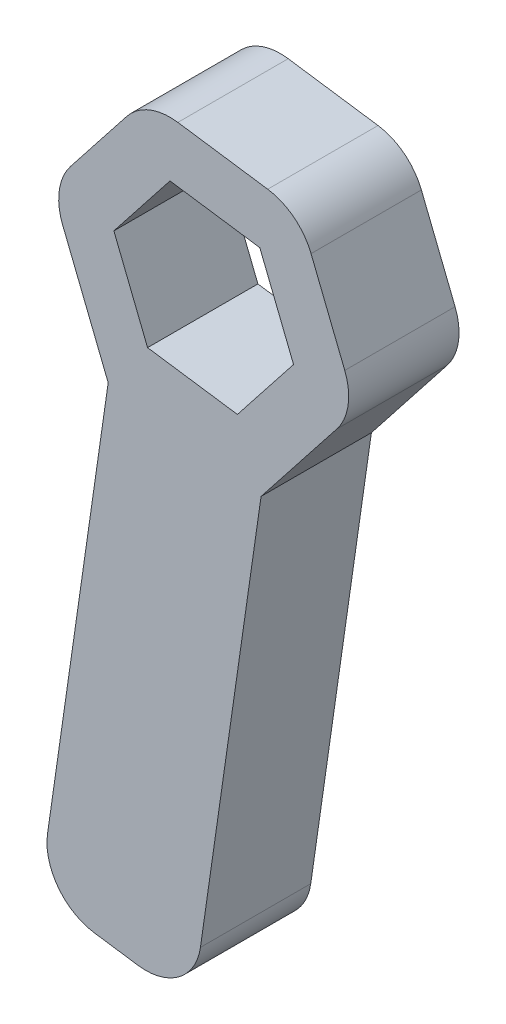
ISO-10303-21;
HEADER;
FILE_DESCRIPTION(('STEP AP214'),'2;1');
FILE_NAME('part.step','',(''),(''),'','','');
FILE_SCHEMA(('AUTOMOTIVE_DESIGN { 1 0 10303 214 1 1 1 1 }'));
ENDSEC;
DATA;
#1=APPLICATION_CONTEXT('core data for automotive mechanical design processes');
#2=APPLICATION_PROTOCOL_DEFINITION('international standard','automotive_design',2000,#1);
#3=PRODUCT_CONTEXT('',#1,'mechanical');
#4=PRODUCT('Part','Part','',(#3));
#5=PRODUCT_RELATED_PRODUCT_CATEGORY('part','',(#4));
#6=PRODUCT_DEFINITION_FORMATION('','',#4);
#7=PRODUCT_DEFINITION_CONTEXT('part definition',#1,'design');
#8=PRODUCT_DEFINITION('design','',#6,#7);
#9=PRODUCT_DEFINITION_SHAPE('','',#8);
#10=(LENGTH_UNIT() NAMED_UNIT(*) SI_UNIT(.MILLI.,.METRE.));
#11=(NAMED_UNIT(*) PLANE_ANGLE_UNIT() SI_UNIT($,.RADIAN.));
#12=(NAMED_UNIT(*) SI_UNIT($,.STERADIAN.) SOLID_ANGLE_UNIT());
#13=UNCERTAINTY_MEASURE_WITH_UNIT(LENGTH_MEASURE(1.E-05),#10,'distance_accuracy_value','');
#14=(GEOMETRIC_REPRESENTATION_CONTEXT(3) GLOBAL_UNCERTAINTY_ASSIGNED_CONTEXT((#13)) GLOBAL_UNIT_ASSIGNED_CONTEXT((#10,
#11,#12)) REPRESENTATION_CONTEXT('',''));
#15=CARTESIAN_POINT('',(0.,0.,0.));
#16=DIRECTION('',(0.,0.,1.));
#17=DIRECTION('',(1.,0.,0.));
#18=AXIS2_PLACEMENT_3D('',#15,#16,#17);
#19=CARTESIAN_POINT('',(-0.406423067225149,-2.82087225702039,4.));
#20=DIRECTION('',(0.14260458499128,0.9897797393054,0.));
#21=DIRECTION('',(-0.9897797393054,0.14260458499128,0.));
#22=AXIS2_PLACEMENT_3D('',#19,#20,#21);
#23=PLANE('',#22);
#24=DIRECTION('',(0.9897797393054,-0.14260458499128,0.));
#25=VECTOR('',#24,1.);
#26=CARTESIAN_POINT('',(-0.406423067225149,-2.82087225702039,0.));
#27=LINE('',#26,#25);
#28=CARTESIAN_POINT('',(-2.03505442416542,-2.58622378975308,0.));
#29=VERTEX_POINT('',#28);
#30=CARTESIAN_POINT('',(1.22220828971512,-3.0555207242877,0.));
#31=VERTEX_POINT('',#30);
#32=EDGE_CURVE('E247',#29,#31,#27,.T.);
#33=ORIENTED_EDGE('',*,*,#32,.F.);
#34=DIRECTION('',(0.,0.,-1.));
#35=VECTOR('',#34,1.);
#36=CARTESIAN_POINT('',(-2.03505442416542,-2.58622378975308,4.));
#37=LINE('',#36,#35);
#38=CARTESIAN_POINT('',(-2.03505442416542,-2.58622378975308,4.));
#39=VERTEX_POINT('',#38);
#40=EDGE_CURVE('E11',#39,#29,#37,.T.);
#41=ORIENTED_EDGE('',*,*,#40,.F.);
#42=DIRECTION('',(0.9897797393054,-0.14260458499128,0.));
#43=VECTOR('',#42,1.);
#44=CARTESIAN_POINT('',(-0.406423067225149,-2.82087225702039,4.));
#45=LINE('',#44,#43);
#46=CARTESIAN_POINT('',(1.22220828971512,-3.0555207242877,4.));
#47=VERTEX_POINT('',#46);
#48=EDGE_CURVE('E561',#39,#47,#45,.T.);
#49=ORIENTED_EDGE('',*,*,#48,.T.);
#50=DIRECTION('',(0.,0.,-1.));
#51=VECTOR('',#50,1.);
#52=CARTESIAN_POINT('',(1.22220828971512,-3.0555207242877,4.));
#53=LINE('',#52,#51);
#54=EDGE_CURVE('E58',#47,#31,#53,.T.);
#55=ORIENTED_EDGE('',*,*,#54,.T.);
#56=EDGE_LOOP('',(#33,#41,#49,#55));
#57=FACE_BOUND('',#56,.T.);
#58=ADVANCED_FACE('F39',(#57),#23,.T.);
#59=CARTESIAN_POINT('',(-2.64615856902298,-1.05846342760923,4.));
#60=DIRECTION('',(0.928476690885255,0.371390676354114,0.));
#61=DIRECTION('',(-0.371390676354114,0.928476690885255,0.));
#62=AXIS2_PLACEMENT_3D('',#59,#60,#61);
#63=PLANE('',#62);
#64=DIRECTION('',(0.371390676354114,-0.928476690885255,0.));
#65=VECTOR('',#64,1.);
#66=CARTESIAN_POINT('',(-2.64615856902298,-1.05846342760923,0.));
#67=LINE('',#66,#65);
#68=CARTESIAN_POINT('',(-3.25726271388054,0.469296934534627,0.));
#69=VERTEX_POINT('',#68);
#70=EDGE_CURVE('E249',#69,#29,#67,.T.);
#71=ORIENTED_EDGE('',*,*,#70,.F.);
#72=DIRECTION('',(0.,0.,-1.));
#73=VECTOR('',#72,1.);
#74=CARTESIAN_POINT('',(-3.25726271388054,0.469296934534627,4.));
#75=LINE('',#74,#73);
#76=CARTESIAN_POINT('',(-3.25726271388054,0.469296934534627,4.));
#77=VERTEX_POINT('',#76);
#78=EDGE_CURVE('E49',#77,#69,#75,.T.);
#79=ORIENTED_EDGE('',*,*,#78,.F.);
#80=DIRECTION('',(0.371390676354114,-0.928476690885255,0.));
#81=VECTOR('',#80,1.);
#82=CARTESIAN_POINT('',(-2.64615856902298,-1.05846342760923,4.));
#83=LINE('',#82,#81);
#84=EDGE_CURVE('E563',#77,#39,#83,.T.);
#85=ORIENTED_EDGE('',*,*,#84,.T.);
#86=ORIENTED_EDGE('',*,*,#40,.T.);
#87=EDGE_LOOP('',(#71,#79,#85,#86));
#88=FACE_BOUND('',#87,.T.);
#89=ADVANCED_FACE('F381',(#88),#63,.T.);
#90=CARTESIAN_POINT('',(-2.23973550179783,1.76240882941116,4.));
#91=DIRECTION('',(0.785872105893975,-0.618389062951286,0.));
#92=DIRECTION('',(0.618389062951286,0.785872105893975,0.));
#93=AXIS2_PLACEMENT_3D('',#90,#91,#92);
#94=PLANE('',#93);
#95=DIRECTION('',(-0.618389062951286,-0.785872105893975,0.));
#96=VECTOR('',#95,1.);
#97=CARTESIAN_POINT('',(-2.23973550179783,1.76240882941116,0.));
#98=LINE('',#97,#96);
#99=CARTESIAN_POINT('',(-1.22220828971512,3.0555207242877,0.));
#100=VERTEX_POINT('',#99);
#101=EDGE_CURVE('E252',#100,#69,#98,.T.);
#102=ORIENTED_EDGE('',*,*,#101,.F.);
#103=DIRECTION('',(0.,0.,-1.));
#104=VECTOR('',#103,1.);
#105=CARTESIAN_POINT('',(-1.22220828971512,3.0555207242877,4.));
#106=LINE('',#105,#104);
#107=CARTESIAN_POINT('',(-1.22220828971512,3.0555207242877,4.));
#108=VERTEX_POINT('',#107);
#109=EDGE_CURVE('E192',#108,#100,#106,.T.);
#110=ORIENTED_EDGE('',*,*,#109,.F.);
#111=DIRECTION('',(-0.618389062951286,-0.785872105893975,0.));
#112=VECTOR('',#111,1.);
#113=CARTESIAN_POINT('',(-2.23973550179783,1.76240882941116,4.));
#114=LINE('',#113,#112);
#115=EDGE_CURVE('E203',#108,#77,#114,.T.);
#116=ORIENTED_EDGE('',*,*,#115,.T.);
#117=ORIENTED_EDGE('',*,*,#78,.T.);
#118=EDGE_LOOP('',(#102,#110,#116,#117));
#119=FACE_BOUND('',#118,.T.);
#120=ADVANCED_FACE('F386',(#119),#94,.T.);
#121=CARTESIAN_POINT('',(0.406423067225149,2.82087225702039,4.));
#122=DIRECTION('',(-0.14260458499128,-0.9897797393054,0.));
#123=DIRECTION('',(0.9897797393054,-0.14260458499128,0.));
#124=AXIS2_PLACEMENT_3D('',#121,#122,#123);
#125=PLANE('',#124);
#126=DIRECTION('',(-0.9897797393054,0.14260458499128,0.));
#127=VECTOR('',#126,1.);
#128=CARTESIAN_POINT('',(0.406423067225149,2.82087225702039,0.));
#129=LINE('',#128,#127);
#130=CARTESIAN_POINT('',(2.03505442416542,2.58622378975308,0.));
#131=VERTEX_POINT('',#130);
#132=EDGE_CURVE('E188',#131,#100,#129,.T.);
#133=ORIENTED_EDGE('',*,*,#132,.F.);
#134=DIRECTION('',(0.,0.,-1.));
#135=VECTOR('',#134,1.);
#136=CARTESIAN_POINT('',(2.03505442416542,2.58622378975308,4.));
#137=LINE('',#136,#135);
#138=CARTESIAN_POINT('',(2.03505442416542,2.58622378975308,4.));
#139=VERTEX_POINT('',#138);
#140=EDGE_CURVE('E183',#139,#131,#137,.T.);
#141=ORIENTED_EDGE('',*,*,#140,.F.);
#142=DIRECTION('',(-0.9897797393054,0.14260458499128,0.));
#143=VECTOR('',#142,1.);
#144=CARTESIAN_POINT('',(0.406423067225149,2.82087225702039,4.));
#145=LINE('',#144,#143);
#146=EDGE_CURVE('E186',#139,#108,#145,.T.);
#147=ORIENTED_EDGE('',*,*,#146,.T.);
#148=ORIENTED_EDGE('',*,*,#109,.T.);
#149=EDGE_LOOP('',(#133,#141,#147,#148));
#150=FACE_BOUND('',#149,.T.);
#151=ADVANCED_FACE('F185',(#150),#125,.T.);
#152=CARTESIAN_POINT('',(2.64615856902298,1.05846342760923,4.));
#153=DIRECTION('',(-0.928476690885255,-0.371390676354114,0.));
#154=DIRECTION('',(0.371390676354114,-0.928476690885255,0.));
#155=AXIS2_PLACEMENT_3D('',#152,#153,#154);
#156=PLANE('',#155);
#157=DIRECTION('',(-0.371390676354114,0.928476690885255,0.));
#158=VECTOR('',#157,1.);
#159=CARTESIAN_POINT('',(2.64615856902298,1.05846342760923,0.));
#160=LINE('',#159,#158);
#161=CARTESIAN_POINT('',(3.25726271388054,-0.469296934534628,0.));
#162=VERTEX_POINT('',#161);
#163=EDGE_CURVE('E256',#162,#131,#160,.T.);
#164=ORIENTED_EDGE('',*,*,#163,.F.);
#165=DIRECTION('',(0.,0.,-1.));
#166=VECTOR('',#165,1.);
#167=CARTESIAN_POINT('',(3.25726271388054,-0.469296934534628,4.));
#168=LINE('',#167,#166);
#169=CARTESIAN_POINT('',(3.25726271388054,-0.469296934534628,4.));
#170=VERTEX_POINT('',#169);
#171=EDGE_CURVE('E119',#170,#162,#168,.T.);
#172=ORIENTED_EDGE('',*,*,#171,.F.);
#173=DIRECTION('',(-0.371390676354114,0.928476690885255,0.));
#174=VECTOR('',#173,1.);
#175=CARTESIAN_POINT('',(2.64615856902298,1.05846342760923,4.));
#176=LINE('',#175,#174);
#177=EDGE_CURVE('E200',#170,#139,#176,.T.);
#178=ORIENTED_EDGE('',*,*,#177,.T.);
#179=ORIENTED_EDGE('',*,*,#140,.T.);
#180=EDGE_LOOP('',(#164,#172,#178,#179));
#181=FACE_BOUND('',#180,.T.);
#182=ADVANCED_FACE('F205',(#181),#156,.T.);
#183=CARTESIAN_POINT('',(-3.25726271388054,0.469296934534626,4.));
#184=DIRECTION('',(0.,0.,-1.));
#185=DIRECTION('',(-1.,0.,0.));
#186=AXIS2_PLACEMENT_3D('',#183,#184,#185);
#187=CYLINDRICAL_SURFACE('',#186,2.);
#188=CARTESIAN_POINT('',(-3.25726271388054,0.469296934534626,0.));
#189=DIRECTION('',(0.,0.,1.));
#190=DIRECTION('',(1.,0.,0.));
#191=AXIS2_PLACEMENT_3D('',#188,#189,#190);
#192=CIRCLE('',#191,2.);
#193=CARTESIAN_POINT('',(-5.11421609565105,-0.273484418173602,0.));
#194=VERTEX_POINT('',#193);
#195=CARTESIAN_POINT('',(-4.82900692566849,1.7060750604372,0.));
#196=VERTEX_POINT('',#195);
#197=EDGE_CURVE('E212',#194,#196,#192,.F.);
#198=ORIENTED_EDGE('',*,*,#197,.F.);
#199=DIRECTION('',(0.,0.,-1.));
#200=VECTOR('',#199,1.);
#201=CARTESIAN_POINT('',(-5.11421609565105,-0.273484418173602,4.));
#202=LINE('',#201,#200);
#203=CARTESIAN_POINT('',(-5.11421609565105,-0.273484418173602,4.));
#204=VERTEX_POINT('',#203);
#205=EDGE_CURVE('E43',#204,#194,#202,.T.);
#206=ORIENTED_EDGE('',*,*,#205,.F.);
#207=CARTESIAN_POINT('',(-3.25726271388054,0.469296934534626,4.));
#208=DIRECTION('',(0.,0.,1.));
#209=DIRECTION('',(1.,0.,0.));
#210=AXIS2_PLACEMENT_3D('',#207,#208,#209);
#211=CIRCLE('',#210,2.);
#212=CARTESIAN_POINT('',(-4.82900692566849,1.7060750604372,4.));
#213=VERTEX_POINT('',#212);
#214=EDGE_CURVE('E261',#204,#213,#211,.F.);
#215=ORIENTED_EDGE('',*,*,#214,.T.);
#216=DIRECTION('',(0.,0.,-1.));
#217=VECTOR('',#216,1.);
#218=CARTESIAN_POINT('',(-4.82900692566849,1.7060750604372,4.));
#219=LINE('',#218,#217);
#220=EDGE_CURVE('E208',#213,#196,#219,.T.);
#221=ORIENTED_EDGE('',*,*,#220,.T.);
#222=EDGE_LOOP('',(#198,#206,#215,#221));
#223=FACE_BOUND('',#222,.T.);
#224=ADVANCED_FACE('F41',(#223),#187,.T.);
#225=CARTESIAN_POINT('',(-4.50311195079349,-1.80124478031746,4.));
#226=DIRECTION('',(0.928476690885255,0.371390676354115,0.));
#227=DIRECTION('',(-0.371390676354115,0.928476690885255,0.));
#228=AXIS2_PLACEMENT_3D('',#225,#226,#227);
#229=PLANE('',#228);
#230=DIRECTION('',(0.371390676354115,-0.928476690885255,0.));
#231=VECTOR('',#230,1.);
#232=CARTESIAN_POINT('',(-4.50311195079349,-1.80124478031746,0.));
#233=LINE('',#232,#231);
#234=CARTESIAN_POINT('',(-3.4631627920008,-4.40111767729909,0.));
#235=VERTEX_POINT('',#234);
#236=EDGE_CURVE('E215',#194,#235,#233,.T.);
#237=ORIENTED_EDGE('',*,*,#236,.T.);
#238=DIRECTION('',(0.,0.,-1.));
#239=VECTOR('',#238,1.);
#240=CARTESIAN_POINT('',(-3.4631627920008,-4.40111767729909,4.));
#241=LINE('',#240,#239);
#242=CARTESIAN_POINT('',(-3.4631627920008,-4.40111767729909,4.));
#243=VERTEX_POINT('',#242);
#244=EDGE_CURVE('E294',#243,#235,#241,.T.);
#245=ORIENTED_EDGE('',*,*,#244,.F.);
#246=DIRECTION('',(0.371390676354115,-0.928476690885255,0.));
#247=VECTOR('',#246,1.);
#248=CARTESIAN_POINT('',(-4.50311195079349,-1.80124478031746,4.));
#249=LINE('',#248,#247);
#250=EDGE_CURVE('E303',#204,#243,#249,.T.);
#251=ORIENTED_EDGE('',*,*,#250,.F.);
#252=ORIENTED_EDGE('',*,*,#205,.T.);
#253=EDGE_LOOP('',(#237,#245,#251,#252));
#254=FACE_BOUND('',#253,.T.);
#255=ADVANCED_FACE('F302',(#254),#229,.F.);
#256=CARTESIAN_POINT('',(-2.77153055479309,0.399314058332094,4.));
#257=DIRECTION('',(0.9897797393054,-0.14260458499128,0.));
#258=DIRECTION('',(0.14260458499128,0.9897797393054,0.));
#259=AXIS2_PLACEMENT_3D('',#256,#257,#258);
#260=PLANE('',#259);
#261=DIRECTION('',(-0.14260458499128,-0.9897797393054,0.));
#262=VECTOR('',#261,1.);
#263=CARTESIAN_POINT('',(-2.77153055479309,0.399314058332094,0.));
#264=LINE('',#263,#262);
#265=CARTESIAN_POINT('',(-5.66170537007195,-19.6606053011237,0.));
#266=VERTEX_POINT('',#265);
#267=EDGE_CURVE('E217',#235,#266,#264,.T.);
#268=ORIENTED_EDGE('',*,*,#267,.T.);
#269=DIRECTION('',(0.,0.,-1.));
#270=VECTOR('',#269,1.);
#271=CARTESIAN_POINT('',(-5.66170537007195,-19.6606053011237,4.));
#272=LINE('',#271,#270);
#273=CARTESIAN_POINT('',(-5.66170537007195,-19.6606053011237,4.));
#274=VERTEX_POINT('',#273);
#275=EDGE_CURVE('E293',#274,#266,#272,.T.);
#276=ORIENTED_EDGE('',*,*,#275,.F.);
#277=DIRECTION('',(-0.14260458499128,-0.9897797393054,0.));
#278=VECTOR('',#277,1.);
#279=CARTESIAN_POINT('',(-2.77153055479309,0.399314058332094,4.));
#280=LINE('',#279,#278);
#281=EDGE_CURVE('E581',#243,#274,#280,.T.);
#282=ORIENTED_EDGE('',*,*,#281,.F.);
#283=ORIENTED_EDGE('',*,*,#244,.T.);
#284=EDGE_LOOP('',(#268,#276,#282,#283));
#285=FACE_BOUND('',#284,.T.);
#286=ADVANCED_FACE('F371',(#285),#260,.F.);
#287=CARTESIAN_POINT('',(-3.68214589146115,-19.9458144711063,4.));
#288=DIRECTION('',(0.,0.,-1.));
#289=DIRECTION('',(-1.,0.,0.));
#290=AXIS2_PLACEMENT_3D('',#287,#288,#289);
#291=CYLINDRICAL_SURFACE('',#290,2.);
#292=CARTESIAN_POINT('',(-3.68214589146115,-19.9458144711063,0.));
#293=DIRECTION('',(0.,0.,1.));
#294=DIRECTION('',(1.,0.,0.));
#295=AXIS2_PLACEMENT_3D('',#292,#293,#294);
#296=CIRCLE('',#295,2.);
#297=CARTESIAN_POINT('',(-3.96735506144371,-21.9253739497171,0.));
#298=VERTEX_POINT('',#297);
#299=EDGE_CURVE('E220',#298,#266,#296,.F.);
#300=ORIENTED_EDGE('',*,*,#299,.F.);
#301=DIRECTION('',(0.,0.,-1.));
#302=VECTOR('',#301,1.);
#303=CARTESIAN_POINT('',(-3.96735506144371,-21.9253739497171,4.));
#304=LINE('',#303,#302);
#305=CARTESIAN_POINT('',(-3.96735506144371,-21.9253739497171,4.));
#306=VERTEX_POINT('',#305);
#307=EDGE_CURVE('E291',#306,#298,#304,.T.);
#308=ORIENTED_EDGE('',*,*,#307,.F.);
#309=CARTESIAN_POINT('',(-3.68214589146115,-19.9458144711063,4.));
#310=DIRECTION('',(0.,0.,1.));
#311=DIRECTION('',(1.,0.,0.));
#312=AXIS2_PLACEMENT_3D('',#309,#310,#311);
#313=CIRCLE('',#312,2.);
#314=EDGE_CURVE('E370',#306,#274,#313,.F.);
#315=ORIENTED_EDGE('',*,*,#314,.T.);
#316=ORIENTED_EDGE('',*,*,#275,.T.);
#317=EDGE_LOOP('',(#300,#308,#315,#316));
#318=FACE_BOUND('',#317,.T.);
#319=ADVANCED_FACE('F365',(#318),#291,.T.);
#320=CARTESIAN_POINT('',(-3.17538398526146,-22.0394788380666,4.));
#321=DIRECTION('',(0.142604584991282,0.989779739305399,0.));
#322=DIRECTION('',(-0.989779739305399,0.142604584991282,0.));
#323=AXIS2_PLACEMENT_3D('',#320,#321,#322);
#324=PLANE('',#323);
#325=DIRECTION('',(0.989779739305399,-0.142604584991282,0.));
#326=VECTOR('',#325,1.);
#327=CARTESIAN_POINT('',(-3.17538398526146,-22.0394788380666,0.));
#328=LINE('',#327,#326);
#329=CARTESIAN_POINT('',(-2.38341290907914,-22.1535837264162,0.));
#330=VERTEX_POINT('',#329);
#331=EDGE_CURVE('E223',#298,#330,#328,.T.);
#332=ORIENTED_EDGE('',*,*,#331,.T.);
#333=DIRECTION('',(0.,0.,-1.));
#334=VECTOR('',#333,1.);
#335=CARTESIAN_POINT('',(-2.38341290907914,-22.1535837264162,4.));
#336=LINE('',#335,#334);
#337=CARTESIAN_POINT('',(-2.38341290907914,-22.1535837264162,4.));
#338=VERTEX_POINT('',#337);
#339=EDGE_CURVE('E289',#338,#330,#336,.T.);
#340=ORIENTED_EDGE('',*,*,#339,.F.);
#341=DIRECTION('',(0.989779739305399,-0.142604584991282,0.));
#342=VECTOR('',#341,1.);
#343=CARTESIAN_POINT('',(-3.17538398526146,-22.0394788380666,4.));
#344=LINE('',#343,#342);
#345=EDGE_CURVE('E578',#306,#338,#344,.T.);
#346=ORIENTED_EDGE('',*,*,#345,.F.);
#347=ORIENTED_EDGE('',*,*,#307,.T.);
#348=EDGE_LOOP('',(#332,#340,#346,#347));
#349=FACE_BOUND('',#348,.T.);
#350=ADVANCED_FACE('F378',(#349),#324,.F.);
#351=CARTESIAN_POINT('',(-2.09820373909657,-20.1740242478054,4.));
#352=DIRECTION('',(0.,0.,-1.));
#353=DIRECTION('',(-1.,0.,0.));
#354=AXIS2_PLACEMENT_3D('',#351,#352,#353);
#355=CYLINDRICAL_SURFACE('',#354,2.);
#356=CARTESIAN_POINT('',(-2.09820373909657,-20.1740242478054,0.));
#357=DIRECTION('',(0.,0.,1.));
#358=DIRECTION('',(1.,0.,0.));
#359=AXIS2_PLACEMENT_3D('',#356,#357,#358);
#360=CIRCLE('',#359,2.);
#361=CARTESIAN_POINT('',(-0.118644260485777,-20.4592334177879,0.));
#362=VERTEX_POINT('',#361);
#363=EDGE_CURVE('E226',#362,#330,#360,.F.);
#364=ORIENTED_EDGE('',*,*,#363,.F.);
#365=DIRECTION('',(0.,0.,-1.));
#366=VECTOR('',#365,1.);
#367=CARTESIAN_POINT('',(-0.118644260485777,-20.4592334177879,4.));
#368=LINE('',#367,#366);
#369=CARTESIAN_POINT('',(-0.118644260485777,-20.4592334177879,4.));
#370=VERTEX_POINT('',#369);
#371=EDGE_CURVE('E287',#370,#362,#368,.T.);
#372=ORIENTED_EDGE('',*,*,#371,.F.);
#373=CARTESIAN_POINT('',(-2.09820373909657,-20.1740242478054,4.));
#374=DIRECTION('',(0.,0.,1.));
#375=DIRECTION('',(1.,0.,0.));
#376=AXIS2_PLACEMENT_3D('',#373,#374,#375);
#377=CIRCLE('',#376,2.);
#378=EDGE_CURVE('E576',#370,#338,#377,.F.);
#379=ORIENTED_EDGE('',*,*,#378,.T.);
#380=ORIENTED_EDGE('',*,*,#339,.T.);
#381=EDGE_LOOP('',(#364,#372,#379,#380));
#382=FACE_BOUND('',#381,.T.);
#383=ADVANCED_FACE('F359',(#382),#355,.T.);
#384=CARTESIAN_POINT('',(2.77153055479309,-0.399314058332094,4.));
#385=DIRECTION('',(0.9897797393054,-0.14260458499128,0.));
#386=DIRECTION('',(0.14260458499128,0.9897797393054,0.));
#387=AXIS2_PLACEMENT_3D('',#384,#385,#386);
#388=PLANE('',#387);
#389=DIRECTION('',(-0.14260458499128,-0.9897797393054,0.));
#390=VECTOR('',#389,1.);
#391=CARTESIAN_POINT('',(2.77153055479309,-0.399314058332094,0.));
#392=LINE('',#391,#390);
#393=CARTESIAN_POINT('',(2.07989831758538,-5.19974579396328,0.));
#394=VERTEX_POINT('',#393);
#395=EDGE_CURVE('E229',#394,#362,#392,.T.);
#396=ORIENTED_EDGE('',*,*,#395,.F.);
#397=DIRECTION('',(0.,0.,-1.));
#398=VECTOR('',#397,1.);
#399=CARTESIAN_POINT('',(2.07989831758538,-5.19974579396328,4.));
#400=LINE('',#399,#398);
#401=CARTESIAN_POINT('',(2.07989831758538,-5.19974579396328,4.));
#402=VERTEX_POINT('',#401);
#403=EDGE_CURVE('E285',#402,#394,#400,.T.);
#404=ORIENTED_EDGE('',*,*,#403,.F.);
#405=DIRECTION('',(-0.14260458499128,-0.9897797393054,0.));
#406=VECTOR('',#405,1.);
#407=CARTESIAN_POINT('',(2.77153055479309,-0.399314058332094,4.));
#408=LINE('',#407,#406);
#409=EDGE_CURVE('E355',#402,#370,#408,.T.);
#410=ORIENTED_EDGE('',*,*,#409,.T.);
#411=ORIENTED_EDGE('',*,*,#371,.T.);
#412=EDGE_LOOP('',(#396,#404,#410,#411));
#413=FACE_BOUND('',#412,.T.);
#414=ADVANCED_FACE('F352',(#413),#388,.T.);
#415=CARTESIAN_POINT('',(3.81147971358578,-2.99918695531374,4.));
#416=DIRECTION('',(-0.785872105893975,0.618389062951286,0.));
#417=DIRECTION('',(-0.618389062951286,-0.785872105893975,0.));
#418=AXIS2_PLACEMENT_3D('',#415,#416,#417);
#419=PLANE('',#418);
#420=DIRECTION('',(0.618389062951286,0.785872105893975,0.));
#421=VECTOR('',#420,1.);
#422=CARTESIAN_POINT('',(3.81147971358578,-2.99918695531374,0.));
#423=LINE('',#422,#421);
#424=CARTESIAN_POINT('',(4.82900692566849,-1.7060750604372,0.));
#425=VERTEX_POINT('',#424);
#426=EDGE_CURVE('E232',#394,#425,#423,.T.);
#427=ORIENTED_EDGE('',*,*,#426,.T.);
#428=DIRECTION('',(0.,0.,-1.));
#429=VECTOR('',#428,1.);
#430=CARTESIAN_POINT('',(4.82900692566849,-1.7060750604372,4.));
#431=LINE('',#430,#429);
#432=CARTESIAN_POINT('',(4.82900692566849,-1.7060750604372,4.));
#433=VERTEX_POINT('',#432);
#434=EDGE_CURVE('E282',#433,#425,#431,.T.);
#435=ORIENTED_EDGE('',*,*,#434,.F.);
#436=DIRECTION('',(0.618389062951286,0.785872105893975,0.));
#437=VECTOR('',#436,1.);
#438=CARTESIAN_POINT('',(3.81147971358578,-2.99918695531374,4.));
#439=LINE('',#438,#437);
#440=EDGE_CURVE('E348',#402,#433,#439,.T.);
#441=ORIENTED_EDGE('',*,*,#440,.F.);
#442=ORIENTED_EDGE('',*,*,#403,.T.);
#443=EDGE_LOOP('',(#427,#435,#441,#442));
#444=FACE_BOUND('',#443,.T.);
#445=ADVANCED_FACE('F347',(#444),#419,.F.);
#446=CARTESIAN_POINT('',(3.25726271388054,-0.469296934534627,4.));
#447=DIRECTION('',(0.,0.,-1.));
#448=DIRECTION('',(-1.,0.,0.));
#449=AXIS2_PLACEMENT_3D('',#446,#447,#448);
#450=CYLINDRICAL_SURFACE('',#449,2.);
#451=CARTESIAN_POINT('',(3.25726271388054,-0.469296934534627,0.));
#452=DIRECTION('',(0.,0.,1.));
#453=DIRECTION('',(1.,0.,0.));
#454=AXIS2_PLACEMENT_3D('',#451,#452,#453);
#455=CIRCLE('',#454,2.);
#456=CARTESIAN_POINT('',(5.11421609565105,0.273484418173602,0.));
#457=VERTEX_POINT('',#456);
#458=EDGE_CURVE('E234',#425,#457,#455,.T.);
#459=ORIENTED_EDGE('',*,*,#458,.T.);
#460=DIRECTION('',(0.,0.,-1.));
#461=VECTOR('',#460,1.);
#462=CARTESIAN_POINT('',(5.11421609565105,0.273484418173602,4.));
#463=LINE('',#462,#461);
#464=CARTESIAN_POINT('',(5.11421609565105,0.273484418173602,4.));
#465=VERTEX_POINT('',#464);
#466=EDGE_CURVE('E279',#465,#457,#463,.T.);
#467=ORIENTED_EDGE('',*,*,#466,.F.);
#468=CARTESIAN_POINT('',(3.25726271388054,-0.469296934534627,4.));
#469=DIRECTION('',(0.,0.,1.));
#470=DIRECTION('',(1.,0.,0.));
#471=AXIS2_PLACEMENT_3D('',#468,#469,#470);
#472=CIRCLE('',#471,2.);
#473=EDGE_CURVE('E343',#433,#465,#472,.T.);
#474=ORIENTED_EDGE('',*,*,#473,.F.);
#475=ORIENTED_EDGE('',*,*,#434,.T.);
#476=EDGE_LOOP('',(#459,#467,#474,#475));
#477=FACE_BOUND('',#476,.T.);
#478=ADVANCED_FACE('F342',(#477),#450,.T.);
#479=CARTESIAN_POINT('',(4.50311195079349,1.80124478031745,4.));
#480=DIRECTION('',(-0.928476690885255,-0.371390676354114,0.));
#481=DIRECTION('',(0.371390676354114,-0.928476690885255,0.));
#482=AXIS2_PLACEMENT_3D('',#479,#480,#481);
#483=PLANE('',#482);
#484=DIRECTION('',(-0.371390676354114,0.928476690885255,0.));
#485=VECTOR('',#484,1.);
#486=CARTESIAN_POINT('',(4.50311195079349,1.80124478031745,0.));
#487=LINE('',#486,#485);
#488=CARTESIAN_POINT('',(3.89200780593593,3.3290051424613,0.));
#489=VERTEX_POINT('',#488);
#490=EDGE_CURVE('E236',#457,#489,#487,.T.);
#491=ORIENTED_EDGE('',*,*,#490,.T.);
#492=DIRECTION('',(0.,0.,-1.));
#493=VECTOR('',#492,1.);
#494=CARTESIAN_POINT('',(3.89200780593593,3.3290051424613,4.));
#495=LINE('',#494,#493);
#496=CARTESIAN_POINT('',(3.89200780593593,3.3290051424613,4.));
#497=VERTEX_POINT('',#496);
#498=EDGE_CURVE('E276',#497,#489,#495,.T.);
#499=ORIENTED_EDGE('',*,*,#498,.F.);
#500=DIRECTION('',(-0.371390676354114,0.928476690885255,0.));
#501=VECTOR('',#500,1.);
#502=CARTESIAN_POINT('',(4.50311195079349,1.80124478031745,4.));
#503=LINE('',#502,#501);
#504=EDGE_CURVE('E339',#465,#497,#503,.T.);
#505=ORIENTED_EDGE('',*,*,#504,.F.);
#506=ORIENTED_EDGE('',*,*,#466,.T.);
#507=EDGE_LOOP('',(#491,#499,#505,#506));
#508=FACE_BOUND('',#507,.T.);
#509=ADVANCED_FACE('F336',(#508),#483,.F.);
#510=CARTESIAN_POINT('',(2.03505442416542,2.58622378975308,4.));
#511=DIRECTION('',(0.,0.,-1.));
#512=DIRECTION('',(-1.,0.,0.));
#513=AXIS2_PLACEMENT_3D('',#510,#511,#512);
#514=CYLINDRICAL_SURFACE('',#513,2.);
#515=CARTESIAN_POINT('',(2.03505442416542,2.58622378975308,0.));
#516=DIRECTION('',(0.,0.,1.));
#517=DIRECTION('',(1.,0.,0.));
#518=AXIS2_PLACEMENT_3D('',#515,#516,#517);
#519=CIRCLE('',#518,2.);
#520=CARTESIAN_POINT('',(2.32026359414798,4.56578326836387,0.));
#521=VERTEX_POINT('',#520);
#522=EDGE_CURVE('E238',#489,#521,#519,.T.);
#523=ORIENTED_EDGE('',*,*,#522,.T.);
#524=DIRECTION('',(0.,0.,-1.));
#525=VECTOR('',#524,1.);
#526=CARTESIAN_POINT('',(2.32026359414798,4.56578326836387,4.));
#527=LINE('',#526,#525);
#528=CARTESIAN_POINT('',(2.32026359414798,4.56578326836387,4.));
#529=VERTEX_POINT('',#528);
#530=EDGE_CURVE('E273',#529,#521,#527,.T.);
#531=ORIENTED_EDGE('',*,*,#530,.F.);
#532=CARTESIAN_POINT('',(2.03505442416542,2.58622378975308,4.));
#533=DIRECTION('',(0.,0.,1.));
#534=DIRECTION('',(1.,0.,0.));
#535=AXIS2_PLACEMENT_3D('',#532,#533,#534);
#536=CIRCLE('',#535,2.);
#537=EDGE_CURVE('E330',#497,#529,#536,.T.);
#538=ORIENTED_EDGE('',*,*,#537,.F.);
#539=ORIENTED_EDGE('',*,*,#498,.T.);
#540=EDGE_LOOP('',(#523,#531,#538,#539));
#541=FACE_BOUND('',#540,.T.);
#542=ADVANCED_FACE('F329',(#541),#514,.T.);
#543=CARTESIAN_POINT('',(0.691632237207709,4.80043173563119,4.));
#544=DIRECTION('',(-0.14260458499128,-0.9897797393054,0.));
#545=DIRECTION('',(0.9897797393054,-0.14260458499128,0.));
#546=AXIS2_PLACEMENT_3D('',#543,#544,#545);
#547=PLANE('',#546);
#548=DIRECTION('',(-0.9897797393054,0.14260458499128,0.));
#549=VECTOR('',#548,1.);
#550=CARTESIAN_POINT('',(0.691632237207709,4.80043173563119,0.));
#551=LINE('',#550,#549);
#552=CARTESIAN_POINT('',(-0.936999119732561,5.0350802028985,0.));
#553=VERTEX_POINT('',#552);
#554=EDGE_CURVE('E240',#521,#553,#551,.T.);
#555=ORIENTED_EDGE('',*,*,#554,.T.);
#556=DIRECTION('',(0.,0.,-1.));
#557=VECTOR('',#556,1.);
#558=CARTESIAN_POINT('',(-0.936999119732561,5.0350802028985,4.));
#559=LINE('',#558,#557);
#560=CARTESIAN_POINT('',(-0.936999119732561,5.0350802028985,4.));
#561=VERTEX_POINT('',#560);
#562=EDGE_CURVE('E270',#561,#553,#559,.T.);
#563=ORIENTED_EDGE('',*,*,#562,.F.);
#564=DIRECTION('',(-0.9897797393054,0.14260458499128,0.));
#565=VECTOR('',#564,1.);
#566=CARTESIAN_POINT('',(0.691632237207709,4.80043173563119,4.));
#567=LINE('',#566,#565);
#568=EDGE_CURVE('E325',#529,#561,#567,.T.);
#569=ORIENTED_EDGE('',*,*,#568,.F.);
#570=ORIENTED_EDGE('',*,*,#530,.T.);
#571=EDGE_LOOP('',(#555,#563,#569,#570));
#572=FACE_BOUND('',#571,.T.);
#573=ADVANCED_FACE('F324',(#572),#547,.F.);
#574=CARTESIAN_POINT('',(-1.22220828971512,3.0555207242877,4.));
#575=DIRECTION('',(0.,0.,-1.));
#576=DIRECTION('',(-1.,0.,0.));
#577=AXIS2_PLACEMENT_3D('',#574,#575,#576);
#578=CYLINDRICAL_SURFACE('',#577,2.);
#579=CARTESIAN_POINT('',(-1.22220828971512,3.0555207242877,0.));
#580=DIRECTION('',(0.,0.,1.));
#581=DIRECTION('',(1.,0.,0.));
#582=AXIS2_PLACEMENT_3D('',#579,#580,#581);
#583=CIRCLE('',#582,2.);
#584=CARTESIAN_POINT('',(-2.79395250150307,4.29229885019027,0.));
#585=VERTEX_POINT('',#584);
#586=EDGE_CURVE('E242',#553,#585,#583,.T.);
#587=ORIENTED_EDGE('',*,*,#586,.T.);
#588=DIRECTION('',(0.,0.,-1.));
#589=VECTOR('',#588,1.);
#590=CARTESIAN_POINT('',(-2.79395250150307,4.29229885019027,4.));
#591=LINE('',#590,#589);
#592=CARTESIAN_POINT('',(-2.79395250150307,4.29229885019027,4.));
#593=VERTEX_POINT('',#592);
#594=EDGE_CURVE('E267',#593,#585,#591,.T.);
#595=ORIENTED_EDGE('',*,*,#594,.F.);
#596=CARTESIAN_POINT('',(-1.22220828971512,3.0555207242877,4.));
#597=DIRECTION('',(0.,0.,1.));
#598=DIRECTION('',(1.,0.,0.));
#599=AXIS2_PLACEMENT_3D('',#596,#597,#598);
#600=CIRCLE('',#599,2.);
#601=EDGE_CURVE('E321',#561,#593,#600,.T.);
#602=ORIENTED_EDGE('',*,*,#601,.F.);
#603=ORIENTED_EDGE('',*,*,#562,.T.);
#604=EDGE_LOOP('',(#587,#595,#602,#603));
#605=FACE_BOUND('',#604,.T.);
#606=ADVANCED_FACE('F318',(#605),#578,.T.);
#607=CARTESIAN_POINT('',(-3.81147971358578,2.99918695531374,4.));
#608=DIRECTION('',(0.785872105893975,-0.618389062951286,0.));
#609=DIRECTION('',(0.618389062951286,0.785872105893975,0.));
#610=AXIS2_PLACEMENT_3D('',#607,#608,#609);
#611=PLANE('',#610);
#612=DIRECTION('',(-0.618389062951286,-0.785872105893975,0.));
#613=VECTOR('',#612,1.);
#614=CARTESIAN_POINT('',(-3.81147971358578,2.99918695531374,0.));
#615=LINE('',#614,#613);
#616=EDGE_CURVE('E244',#585,#196,#615,.T.);
#617=ORIENTED_EDGE('',*,*,#616,.T.);
#618=ORIENTED_EDGE('',*,*,#220,.F.);
#619=DIRECTION('',(-0.618389062951286,-0.785872105893975,0.));
#620=VECTOR('',#619,1.);
#621=CARTESIAN_POINT('',(-3.81147971358578,2.99918695531374,4.));
#622=LINE('',#621,#620);
#623=EDGE_CURVE('E564',#593,#213,#622,.T.);
#624=ORIENTED_EDGE('',*,*,#623,.F.);
#625=ORIENTED_EDGE('',*,*,#594,.T.);
#626=EDGE_LOOP('',(#617,#618,#624,#625));
#627=FACE_BOUND('',#626,.T.);
#628=ADVANCED_FACE('F312',(#627),#611,.F.);
#629=CARTESIAN_POINT('',(2.23973550179783,-1.76240882941117,4.));
#630=DIRECTION('',(-0.785872105893975,0.618389062951286,0.));
#631=DIRECTION('',(-0.618389062951286,-0.785872105893975,0.));
#632=AXIS2_PLACEMENT_3D('',#629,#630,#631);
#633=PLANE('',#632);
#634=DIRECTION('',(0.618389062951286,0.785872105893975,0.));
#635=VECTOR('',#634,1.);
#636=CARTESIAN_POINT('',(2.23973550179783,-1.76240882941117,0.));
#637=LINE('',#636,#635);
#638=EDGE_CURVE('E258',#31,#162,#637,.T.);
#639=ORIENTED_EDGE('',*,*,#638,.F.);
#640=ORIENTED_EDGE('',*,*,#54,.F.);
#641=DIRECTION('',(0.618389062951286,0.785872105893975,0.));
#642=VECTOR('',#641,1.);
#643=CARTESIAN_POINT('',(2.23973550179783,-1.76240882941117,4.));
#644=LINE('',#643,#642);
#645=EDGE_CURVE('E206',#47,#170,#644,.T.);
#646=ORIENTED_EDGE('',*,*,#645,.T.);
#647=ORIENTED_EDGE('',*,*,#171,.T.);
#648=EDGE_LOOP('',(#639,#640,#646,#647));
#649=FACE_BOUND('',#648,.T.);
#650=ADVANCED_FACE('F393',(#649),#633,.T.);
#651=CARTESIAN_POINT('',(0.,0.,4.));
#652=DIRECTION('',(0.,0.,1.));
#653=DIRECTION('',(1.,0.,0.));
#654=AXIS2_PLACEMENT_3D('',#651,#652,#653);
#655=PLANE('',#654);
#656=ORIENTED_EDGE('',*,*,#214,.F.);
#657=ORIENTED_EDGE('',*,*,#250,.T.);
#658=ORIENTED_EDGE('',*,*,#281,.T.);
#659=ORIENTED_EDGE('',*,*,#314,.F.);
#660=ORIENTED_EDGE('',*,*,#345,.T.);
#661=ORIENTED_EDGE('',*,*,#378,.F.);
#662=ORIENTED_EDGE('',*,*,#409,.F.);
#663=ORIENTED_EDGE('',*,*,#440,.T.);
#664=ORIENTED_EDGE('',*,*,#473,.T.);
#665=ORIENTED_EDGE('',*,*,#504,.T.);
#666=ORIENTED_EDGE('',*,*,#537,.T.);
#667=ORIENTED_EDGE('',*,*,#568,.T.);
#668=ORIENTED_EDGE('',*,*,#601,.T.);
#669=ORIENTED_EDGE('',*,*,#623,.T.);
#670=EDGE_LOOP('',(#656,#657,#658,#659,#660,#661,#662,#663,#664,#665,#666,#667,#668,#669));
#671=FACE_BOUND('',#670,.T.);
#672=ORIENTED_EDGE('',*,*,#48,.F.);
#673=ORIENTED_EDGE('',*,*,#84,.F.);
#674=ORIENTED_EDGE('',*,*,#115,.F.);
#675=ORIENTED_EDGE('',*,*,#146,.F.);
#676=ORIENTED_EDGE('',*,*,#177,.F.);
#677=ORIENTED_EDGE('',*,*,#645,.F.);
#678=EDGE_LOOP('',(#672,#673,#674,#675,#676,#677));
#679=FACE_BOUND('',#678,.T.);
#680=ADVANCED_FACE('F198',(#671,#679),#655,.T.);
#681=CARTESIAN_POINT('',(0.,0.,0.));
#682=DIRECTION('',(0.,0.,1.));
#683=DIRECTION('',(1.,0.,0.));
#684=AXIS2_PLACEMENT_3D('',#681,#682,#683);
#685=PLANE('',#684);
#686=ORIENTED_EDGE('',*,*,#197,.T.);
#687=ORIENTED_EDGE('',*,*,#616,.F.);
#688=ORIENTED_EDGE('',*,*,#586,.F.);
#689=ORIENTED_EDGE('',*,*,#554,.F.);
#690=ORIENTED_EDGE('',*,*,#522,.F.);
#691=ORIENTED_EDGE('',*,*,#490,.F.);
#692=ORIENTED_EDGE('',*,*,#458,.F.);
#693=ORIENTED_EDGE('',*,*,#426,.F.);
#694=ORIENTED_EDGE('',*,*,#395,.T.);
#695=ORIENTED_EDGE('',*,*,#363,.T.);
#696=ORIENTED_EDGE('',*,*,#331,.F.);
#697=ORIENTED_EDGE('',*,*,#299,.T.);
#698=ORIENTED_EDGE('',*,*,#267,.F.);
#699=ORIENTED_EDGE('',*,*,#236,.F.);
#700=EDGE_LOOP('',(#686,#687,#688,#689,#690,#691,#692,#693,#694,#695,#696,#697,#698,#699));
#701=FACE_BOUND('',#700,.T.);
#702=ORIENTED_EDGE('',*,*,#32,.T.);
#703=ORIENTED_EDGE('',*,*,#638,.T.);
#704=ORIENTED_EDGE('',*,*,#163,.T.);
#705=ORIENTED_EDGE('',*,*,#132,.T.);
#706=ORIENTED_EDGE('',*,*,#101,.T.);
#707=ORIENTED_EDGE('',*,*,#70,.T.);
#708=EDGE_LOOP('',(#702,#703,#704,#705,#706,#707));
#709=FACE_BOUND('',#708,.T.);
#710=ADVANCED_FACE('F306',(#701,#709),#685,.F.);
#711=CLOSED_SHELL('',(#58,#89,#120,#151,#182,#224,#255,#286,#319,#350,#383,#414,#445,#478,#509,
#542,#573,#606,#628,#650,#680,#710));
#712=MANIFOLD_SOLID_BREP('B2',#711);
#713=ADVANCED_BREP_SHAPE_REPRESENTATION('',(#18,#712),#14);
#714=SHAPE_DEFINITION_REPRESENTATION(#9,#713);
ENDSEC;
END-ISO-10303-21;
